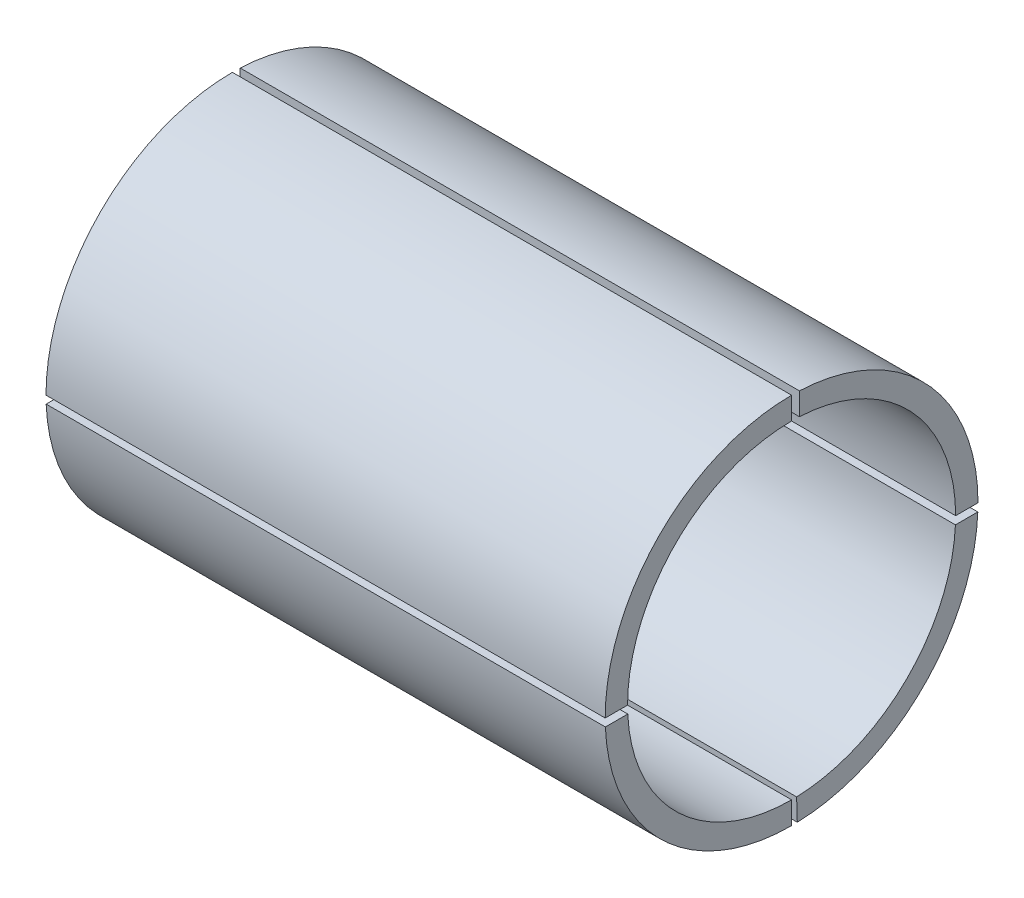
ISO-10303-21;
HEADER;
FILE_DESCRIPTION(('STEP AP214'),'2;1');
FILE_NAME('part.step','',(''),(''),'','','');
FILE_SCHEMA(('AUTOMOTIVE_DESIGN { 1 0 10303 214 1 1 1 1 }'));
ENDSEC;
DATA;
#1=APPLICATION_CONTEXT('core data for automotive mechanical design processes');
#2=APPLICATION_PROTOCOL_DEFINITION('international standard','automotive_design',2000,#1);
#3=PRODUCT_CONTEXT('',#1,'mechanical');
#4=PRODUCT('Part','Part','',(#3));
#5=PRODUCT_RELATED_PRODUCT_CATEGORY('part','',(#4));
#6=PRODUCT_DEFINITION_FORMATION('','',#4);
#7=PRODUCT_DEFINITION_CONTEXT('part definition',#1,'design');
#8=PRODUCT_DEFINITION('design','',#6,#7);
#9=PRODUCT_DEFINITION_SHAPE('','',#8);
#10=(LENGTH_UNIT() NAMED_UNIT(*) SI_UNIT(.MILLI.,.METRE.));
#11=(NAMED_UNIT(*) PLANE_ANGLE_UNIT() SI_UNIT($,.RADIAN.));
#12=(NAMED_UNIT(*) SI_UNIT($,.STERADIAN.) SOLID_ANGLE_UNIT());
#13=UNCERTAINTY_MEASURE_WITH_UNIT(LENGTH_MEASURE(1.E-05),#10,'distance_accuracy_value','');
#14=(GEOMETRIC_REPRESENTATION_CONTEXT(3) GLOBAL_UNCERTAINTY_ASSIGNED_CONTEXT((#13)) GLOBAL_UNIT_ASSIGNED_CONTEXT((#10,
#11,#12)) REPRESENTATION_CONTEXT('',''));
#15=CARTESIAN_POINT('',(0.,0.,0.));
#16=DIRECTION('',(0.,0.,1.));
#17=DIRECTION('',(1.,0.,0.));
#18=AXIS2_PLACEMENT_3D('',#15,#16,#17);
#19=CARTESIAN_POINT('',(15.,0.,0.));
#20=DIRECTION('',(-1.,0.,0.));
#21=DIRECTION('',(0.,0.,1.));
#22=AXIS2_PLACEMENT_3D('',#19,#20,#21);
#23=CYLINDRICAL_SURFACE('',#22,4.4);
#24=CARTESIAN_POINT('',(0.,0.,0.));
#25=DIRECTION('',(-1.,0.,0.));
#26=DIRECTION('',(0.,0.,-1.));
#27=AXIS2_PLACEMENT_3D('',#24,#25,#26);
#28=CIRCLE('',#27,4.4);
#29=CARTESIAN_POINT('',(0.,-0.209377525980943,-4.39501547797207));
#30=VERTEX_POINT('',#29);
#31=CARTESIAN_POINT('',(0.,-4.39794629655566,-0.134418646817995));
#32=VERTEX_POINT('',#31);
#33=EDGE_CURVE('E107',#30,#32,#28,.T.);
#34=ORIENTED_EDGE('',*,*,#33,.T.);
#35=DIRECTION('',(-1.,0.,0.));
#36=VECTOR('',#35,1.);
#37=CARTESIAN_POINT('',(15.,-4.39794629655566,-0.134418646817995));
#38=LINE('',#37,#36);
#39=CARTESIAN_POINT('',(15.,-4.39794629655566,-0.134418646817995));
#40=VERTEX_POINT('',#39);
#41=EDGE_CURVE('E12',#40,#32,#38,.T.);
#42=ORIENTED_EDGE('',*,*,#41,.F.);
#43=CARTESIAN_POINT('',(15.,0.,0.));
#44=DIRECTION('',(-1.,0.,0.));
#45=DIRECTION('',(0.,0.,-1.));
#46=AXIS2_PLACEMENT_3D('',#43,#44,#45);
#47=CIRCLE('',#46,4.4);
#48=CARTESIAN_POINT('',(15.,-0.209377525980943,-4.39501547797207));
#49=VERTEX_POINT('',#48);
#50=EDGE_CURVE('E95',#49,#40,#47,.T.);
#51=ORIENTED_EDGE('',*,*,#50,.F.);
#52=DIRECTION('',(-1.,0.,0.));
#53=VECTOR('',#52,1.);
#54=CARTESIAN_POINT('',(15.,-0.209377525980943,-4.39501547797207));
#55=LINE('',#54,#53);
#56=EDGE_CURVE('E103',#49,#30,#55,.T.);
#57=ORIENTED_EDGE('',*,*,#56,.T.);
#58=EDGE_LOOP('',(#34,#42,#51,#57));
#59=FACE_BOUND('',#58,.T.);
#60=ADVANCED_FACE('F44',(#59),#23,.F.);
#61=CARTESIAN_POINT('',(15.,-4.39794629655566,-0.134418646817995));
#62=DIRECTION('',(0.,0.0305496924586351,-0.999533249217195));
#63=DIRECTION('',(0.,0.999533249217195,0.0305496924586351));
#64=AXIS2_PLACEMENT_3D('',#61,#62,#63);
#65=PLANE('',#64);
#66=DIRECTION('',(0.,-0.999533249217195,-0.0305496924586351));
#67=VECTOR('',#66,1.);
#68=CARTESIAN_POINT('',(0.,-4.39794629655566,-0.134418646817995));
#69=LINE('',#68,#67);
#70=CARTESIAN_POINT('',(0.,-4.99766624608598,-0.152748462293174));
#71=VERTEX_POINT('',#70);
#72=EDGE_CURVE('E99',#32,#71,#69,.T.);
#73=ORIENTED_EDGE('',*,*,#72,.T.);
#74=DIRECTION('',(-1.,0.,0.));
#75=VECTOR('',#74,1.);
#76=CARTESIAN_POINT('',(15.,-4.99766624608598,-0.152748462293174));
#77=LINE('',#76,#75);
#78=CARTESIAN_POINT('',(15.,-4.99766624608598,-0.152748462293174));
#79=VERTEX_POINT('',#78);
#80=EDGE_CURVE('E52',#79,#71,#77,.T.);
#81=ORIENTED_EDGE('',*,*,#80,.F.);
#82=DIRECTION('',(0.,-0.999533249217195,-0.0305496924586351));
#83=VECTOR('',#82,1.);
#84=CARTESIAN_POINT('',(15.,-4.39794629655566,-0.134418646817995));
#85=LINE('',#84,#83);
#86=EDGE_CURVE('E90',#40,#79,#85,.T.);
#87=ORIENTED_EDGE('',*,*,#86,.F.);
#88=ORIENTED_EDGE('',*,*,#41,.T.);
#89=EDGE_LOOP('',(#73,#81,#87,#88));
#90=FACE_BOUND('',#89,.T.);
#91=ADVANCED_FACE('F98',(#90),#65,.F.);
#92=CARTESIAN_POINT('',(15.,0.,0.));
#93=DIRECTION('',(-1.,0.,0.));
#94=DIRECTION('',(0.,0.,1.));
#95=AXIS2_PLACEMENT_3D('',#92,#93,#94);
#96=CYLINDRICAL_SURFACE('',#95,5.);
#97=CARTESIAN_POINT('',(0.,0.,0.));
#98=DIRECTION('',(1.,0.,0.));
#99=DIRECTION('',(0.,0.,-1.));
#100=AXIS2_PLACEMENT_3D('',#97,#98,#99);
#101=CIRCLE('',#100,5.);
#102=CARTESIAN_POINT('',(0.,-0.209377525980943,-4.99561418162113));
#103=VERTEX_POINT('',#102);
#104=EDGE_CURVE('E77',#71,#103,#101,.T.);
#105=ORIENTED_EDGE('',*,*,#104,.T.);
#106=DIRECTION('',(-1.,0.,0.));
#107=VECTOR('',#106,1.);
#108=CARTESIAN_POINT('',(15.,-0.209377525980943,-4.99561418162113));
#109=LINE('',#108,#107);
#110=CARTESIAN_POINT('',(15.,-0.209377525980943,-4.99561418162113));
#111=VERTEX_POINT('',#110);
#112=EDGE_CURVE('E100',#111,#103,#109,.T.);
#113=ORIENTED_EDGE('',*,*,#112,.F.);
#114=CARTESIAN_POINT('',(15.,0.,0.));
#115=DIRECTION('',(1.,0.,0.));
#116=DIRECTION('',(0.,0.,-1.));
#117=AXIS2_PLACEMENT_3D('',#114,#115,#116);
#118=CIRCLE('',#117,5.);
#119=EDGE_CURVE('E93',#79,#111,#118,.T.);
#120=ORIENTED_EDGE('',*,*,#119,.F.);
#121=ORIENTED_EDGE('',*,*,#80,.T.);
#122=EDGE_LOOP('',(#105,#113,#120,#121));
#123=FACE_BOUND('',#122,.T.);
#124=ADVANCED_FACE('F101',(#123),#96,.T.);
#125=CARTESIAN_POINT('',(15.,-0.209377525980943,-4.39501547797207));
#126=DIRECTION('',(0.,-1.,0.));
#127=DIRECTION('',(0.,0.,-1.));
#128=AXIS2_PLACEMENT_3D('',#125,#126,#127);
#129=PLANE('',#128);
#130=DIRECTION('',(0.,0.,1.));
#131=VECTOR('',#130,1.);
#132=CARTESIAN_POINT('',(0.,-0.209377525980943,-4.39501547797207));
#133=LINE('',#132,#131);
#134=EDGE_CURVE('E83',#103,#30,#133,.T.);
#135=ORIENTED_EDGE('',*,*,#134,.T.);
#136=ORIENTED_EDGE('',*,*,#56,.F.);
#137=DIRECTION('',(0.,0.,1.));
#138=VECTOR('',#137,1.);
#139=CARTESIAN_POINT('',(15.,-0.209377525980943,-4.39501547797207));
#140=LINE('',#139,#138);
#141=EDGE_CURVE('E60',#111,#49,#140,.T.);
#142=ORIENTED_EDGE('',*,*,#141,.F.);
#143=ORIENTED_EDGE('',*,*,#112,.T.);
#144=EDGE_LOOP('',(#135,#136,#142,#143));
#145=FACE_BOUND('',#144,.T.);
#146=ADVANCED_FACE('F114',(#145),#129,.F.);
#147=CARTESIAN_POINT('',(15.,0.,0.));
#148=DIRECTION('',(1.,0.,0.));
#149=DIRECTION('',(0.,0.,-1.));
#150=AXIS2_PLACEMENT_3D('',#147,#148,#149);
#151=PLANE('',#150);
#152=ORIENTED_EDGE('',*,*,#50,.T.);
#153=ORIENTED_EDGE('',*,*,#86,.T.);
#154=ORIENTED_EDGE('',*,*,#119,.T.);
#155=ORIENTED_EDGE('',*,*,#141,.T.);
#156=EDGE_LOOP('',(#152,#153,#154,#155));
#157=FACE_BOUND('',#156,.T.);
#158=ADVANCED_FACE('F91',(#157),#151,.T.);
#159=CARTESIAN_POINT('',(0.,0.,0.));
#160=DIRECTION('',(1.,0.,0.));
#161=DIRECTION('',(0.,0.,-1.));
#162=AXIS2_PLACEMENT_3D('',#159,#160,#161);
#163=PLANE('',#162);
#164=ORIENTED_EDGE('',*,*,#33,.F.);
#165=ORIENTED_EDGE('',*,*,#134,.F.);
#166=ORIENTED_EDGE('',*,*,#104,.F.);
#167=ORIENTED_EDGE('',*,*,#72,.F.);
#168=EDGE_LOOP('',(#164,#165,#166,#167));
#169=FACE_BOUND('',#168,.T.);
#170=ADVANCED_FACE('F117',(#169),#163,.F.);
#171=CLOSED_SHELL('',(#60,#91,#124,#146,#158,#170));
#172=MANIFOLD_SOLID_BREP('B2',#171);
#173=CARTESIAN_POINT('',(15.,0.,0.));
#174=DIRECTION('',(-1.,0.,0.));
#175=DIRECTION('',(0.,0.,1.));
#176=AXIS2_PLACEMENT_3D('',#173,#174,#175);
#177=CYLINDRICAL_SURFACE('',#176,5.);
#178=CARTESIAN_POINT('',(0.,0.,0.));
#179=DIRECTION('',(1.,0.,0.));
#180=DIRECTION('',(0.,0.,-1.));
#181=AXIS2_PLACEMENT_3D('',#178,#179,#180);
#182=CIRCLE('',#181,5.);
#183=CARTESIAN_POINT('',(0.,-0.209377525980943,4.99561418162113));
#184=VERTEX_POINT('',#183);
#185=CARTESIAN_POINT('',(0.,-5.,0.));
#186=VERTEX_POINT('',#185);
#187=EDGE_CURVE('E241',#184,#186,#182,.T.);
#188=ORIENTED_EDGE('',*,*,#187,.T.);
#189=DIRECTION('',(-1.,0.,0.));
#190=VECTOR('',#189,1.);
#191=CARTESIAN_POINT('',(15.,-5.,0.));
#192=LINE('',#191,#190);
#193=CARTESIAN_POINT('',(15.,-5.,0.));
#194=VERTEX_POINT('',#193);
#195=EDGE_CURVE('E42',#194,#186,#192,.T.);
#196=ORIENTED_EDGE('',*,*,#195,.F.);
#197=CARTESIAN_POINT('',(15.,0.,0.));
#198=DIRECTION('',(1.,0.,0.));
#199=DIRECTION('',(0.,0.,-1.));
#200=AXIS2_PLACEMENT_3D('',#197,#198,#199);
#201=CIRCLE('',#200,5.);
#202=CARTESIAN_POINT('',(15.,-0.209377525980943,4.99561418162113));
#203=VERTEX_POINT('',#202);
#204=EDGE_CURVE('E229',#203,#194,#201,.T.);
#205=ORIENTED_EDGE('',*,*,#204,.F.);
#206=DIRECTION('',(-1.,0.,0.));
#207=VECTOR('',#206,1.);
#208=CARTESIAN_POINT('',(15.,-0.209377525980943,4.99561418162113));
#209=LINE('',#208,#207);
#210=EDGE_CURVE('E237',#203,#184,#209,.T.);
#211=ORIENTED_EDGE('',*,*,#210,.T.);
#212=EDGE_LOOP('',(#188,#196,#205,#211));
#213=FACE_BOUND('',#212,.T.);
#214=ADVANCED_FACE('F178',(#213),#177,.T.);
#215=CARTESIAN_POINT('',(15.,-4.4,0.));
#216=DIRECTION('',(0.,0.,1.));
#217=DIRECTION('',(0.,-1.,0.));
#218=AXIS2_PLACEMENT_3D('',#215,#216,#217);
#219=PLANE('',#218);
#220=DIRECTION('',(0.,1.,0.));
#221=VECTOR('',#220,1.);
#222=CARTESIAN_POINT('',(0.,-4.4,0.));
#223=LINE('',#222,#221);
#224=CARTESIAN_POINT('',(0.,-4.4,0.));
#225=VERTEX_POINT('',#224);
#226=EDGE_CURVE('E233',#186,#225,#223,.T.);
#227=ORIENTED_EDGE('',*,*,#226,.T.);
#228=DIRECTION('',(-1.,0.,0.));
#229=VECTOR('',#228,1.);
#230=CARTESIAN_POINT('',(15.,-4.4,0.));
#231=LINE('',#230,#229);
#232=CARTESIAN_POINT('',(15.,-4.4,0.));
#233=VERTEX_POINT('',#232);
#234=EDGE_CURVE('E186',#233,#225,#231,.T.);
#235=ORIENTED_EDGE('',*,*,#234,.F.);
#236=DIRECTION('',(0.,1.,0.));
#237=VECTOR('',#236,1.);
#238=CARTESIAN_POINT('',(15.,-4.4,0.));
#239=LINE('',#238,#237);
#240=EDGE_CURVE('E224',#194,#233,#239,.T.);
#241=ORIENTED_EDGE('',*,*,#240,.F.);
#242=ORIENTED_EDGE('',*,*,#195,.T.);
#243=EDGE_LOOP('',(#227,#235,#241,#242));
#244=FACE_BOUND('',#243,.T.);
#245=ADVANCED_FACE('F232',(#244),#219,.F.);
#246=CARTESIAN_POINT('',(15.,0.,0.));
#247=DIRECTION('',(-1.,0.,0.));
#248=DIRECTION('',(0.,0.,1.));
#249=AXIS2_PLACEMENT_3D('',#246,#247,#248);
#250=CYLINDRICAL_SURFACE('',#249,4.4);
#251=CARTESIAN_POINT('',(0.,0.,0.));
#252=DIRECTION('',(-1.,0.,0.));
#253=DIRECTION('',(0.,0.,-1.));
#254=AXIS2_PLACEMENT_3D('',#251,#252,#253);
#255=CIRCLE('',#254,4.4);
#256=CARTESIAN_POINT('',(0.,-0.209377525980942,4.39501547797207));
#257=VERTEX_POINT('',#256);
#258=EDGE_CURVE('E211',#225,#257,#255,.T.);
#259=ORIENTED_EDGE('',*,*,#258,.T.);
#260=DIRECTION('',(-1.,0.,0.));
#261=VECTOR('',#260,1.);
#262=CARTESIAN_POINT('',(15.,-0.209377525980942,4.39501547797207));
#263=LINE('',#262,#261);
#264=CARTESIAN_POINT('',(15.,-0.209377525980942,4.39501547797207));
#265=VERTEX_POINT('',#264);
#266=EDGE_CURVE('E234',#265,#257,#263,.T.);
#267=ORIENTED_EDGE('',*,*,#266,.F.);
#268=CARTESIAN_POINT('',(15.,0.,0.));
#269=DIRECTION('',(-1.,0.,0.));
#270=DIRECTION('',(0.,0.,-1.));
#271=AXIS2_PLACEMENT_3D('',#268,#269,#270);
#272=CIRCLE('',#271,4.4);
#273=EDGE_CURVE('E227',#233,#265,#272,.T.);
#274=ORIENTED_EDGE('',*,*,#273,.F.);
#275=ORIENTED_EDGE('',*,*,#234,.T.);
#276=EDGE_LOOP('',(#259,#267,#274,#275));
#277=FACE_BOUND('',#276,.T.);
#278=ADVANCED_FACE('F235',(#277),#250,.F.);
#279=CARTESIAN_POINT('',(15.,-0.209377525980943,4.39501547797207));
#280=DIRECTION('',(0.,-1.,0.));
#281=DIRECTION('',(0.,0.,-1.));
#282=AXIS2_PLACEMENT_3D('',#279,#280,#281);
#283=PLANE('',#282);
#284=DIRECTION('',(0.,0.,1.));
#285=VECTOR('',#284,1.);
#286=CARTESIAN_POINT('',(0.,-0.209377525980943,4.39501547797207));
#287=LINE('',#286,#285);
#288=EDGE_CURVE('E217',#257,#184,#287,.T.);
#289=ORIENTED_EDGE('',*,*,#288,.T.);
#290=ORIENTED_EDGE('',*,*,#210,.F.);
#291=DIRECTION('',(0.,0.,1.));
#292=VECTOR('',#291,1.);
#293=CARTESIAN_POINT('',(15.,-0.209377525980943,4.39501547797207));
#294=LINE('',#293,#292);
#295=EDGE_CURVE('E194',#265,#203,#294,.T.);
#296=ORIENTED_EDGE('',*,*,#295,.F.);
#297=ORIENTED_EDGE('',*,*,#266,.T.);
#298=EDGE_LOOP('',(#289,#290,#296,#297));
#299=FACE_BOUND('',#298,.T.);
#300=ADVANCED_FACE('F248',(#299),#283,.F.);
#301=CARTESIAN_POINT('',(15.,0.,0.));
#302=DIRECTION('',(1.,0.,0.));
#303=DIRECTION('',(0.,0.,-1.));
#304=AXIS2_PLACEMENT_3D('',#301,#302,#303);
#305=PLANE('',#304);
#306=ORIENTED_EDGE('',*,*,#204,.T.);
#307=ORIENTED_EDGE('',*,*,#240,.T.);
#308=ORIENTED_EDGE('',*,*,#273,.T.);
#309=ORIENTED_EDGE('',*,*,#295,.T.);
#310=EDGE_LOOP('',(#306,#307,#308,#309));
#311=FACE_BOUND('',#310,.T.);
#312=ADVANCED_FACE('F225',(#311),#305,.T.);
#313=CARTESIAN_POINT('',(0.,0.,0.));
#314=DIRECTION('',(1.,0.,0.));
#315=DIRECTION('',(0.,0.,-1.));
#316=AXIS2_PLACEMENT_3D('',#313,#314,#315);
#317=PLANE('',#316);
#318=ORIENTED_EDGE('',*,*,#187,.F.);
#319=ORIENTED_EDGE('',*,*,#288,.F.);
#320=ORIENTED_EDGE('',*,*,#258,.F.);
#321=ORIENTED_EDGE('',*,*,#226,.F.);
#322=EDGE_LOOP('',(#318,#319,#320,#321));
#323=FACE_BOUND('',#322,.T.);
#324=ADVANCED_FACE('F251',(#323),#317,.F.);
#325=CLOSED_SHELL('',(#214,#245,#278,#300,#312,#324));
#326=MANIFOLD_SOLID_BREP('B6',#325);
#327=CARTESIAN_POINT('',(15.,0.,0.));
#328=DIRECTION('',(-1.,0.,0.));
#329=DIRECTION('',(0.,0.,1.));
#330=AXIS2_PLACEMENT_3D('',#327,#328,#329);
#331=CYLINDRICAL_SURFACE('',#330,4.4);
#332=CARTESIAN_POINT('',(0.,0.,0.));
#333=DIRECTION('',(-1.,0.,0.));
#334=DIRECTION('',(0.,0.,-1.));
#335=AXIS2_PLACEMENT_3D('',#332,#333,#334);
#336=CIRCLE('',#335,4.4);
#337=CARTESIAN_POINT('',(0.,0.,4.4));
#338=VERTEX_POINT('',#337);
#339=CARTESIAN_POINT('',(0.,4.4,0.));
#340=VERTEX_POINT('',#339);
#341=EDGE_CURVE('E374',#338,#340,#336,.T.);
#342=ORIENTED_EDGE('',*,*,#341,.T.);
#343=DIRECTION('',(-1.,0.,0.));
#344=VECTOR('',#343,1.);
#345=CARTESIAN_POINT('',(15.,4.4,0.));
#346=LINE('',#345,#344);
#347=CARTESIAN_POINT('',(15.,4.4,0.));
#348=VERTEX_POINT('',#347);
#349=EDGE_CURVE('E176',#348,#340,#346,.T.);
#350=ORIENTED_EDGE('',*,*,#349,.F.);
#351=CARTESIAN_POINT('',(15.,0.,0.));
#352=DIRECTION('',(-1.,0.,0.));
#353=DIRECTION('',(0.,0.,-1.));
#354=AXIS2_PLACEMENT_3D('',#351,#352,#353);
#355=CIRCLE('',#354,4.4);
#356=CARTESIAN_POINT('',(15.,0.,4.4));
#357=VERTEX_POINT('',#356);
#358=EDGE_CURVE('E362',#357,#348,#355,.T.);
#359=ORIENTED_EDGE('',*,*,#358,.F.);
#360=DIRECTION('',(-1.,0.,0.));
#361=VECTOR('',#360,1.);
#362=CARTESIAN_POINT('',(15.,0.,4.4));
#363=LINE('',#362,#361);
#364=EDGE_CURVE('E370',#357,#338,#363,.T.);
#365=ORIENTED_EDGE('',*,*,#364,.T.);
#366=EDGE_LOOP('',(#342,#350,#359,#365));
#367=FACE_BOUND('',#366,.T.);
#368=ADVANCED_FACE('F311',(#367),#331,.F.);
#369=CARTESIAN_POINT('',(15.,5.,0.));
#370=DIRECTION('',(0.,0.,1.));
#371=DIRECTION('',(0.,-1.,0.));
#372=AXIS2_PLACEMENT_3D('',#369,#370,#371);
#373=PLANE('',#372);
#374=DIRECTION('',(0.,1.,0.));
#375=VECTOR('',#374,1.);
#376=CARTESIAN_POINT('',(0.,5.,0.));
#377=LINE('',#376,#375);
#378=CARTESIAN_POINT('',(0.,5.,0.));
#379=VERTEX_POINT('',#378);
#380=EDGE_CURVE('E366',#340,#379,#377,.T.);
#381=ORIENTED_EDGE('',*,*,#380,.T.);
#382=DIRECTION('',(-1.,0.,0.));
#383=VECTOR('',#382,1.);
#384=CARTESIAN_POINT('',(15.,5.,0.));
#385=LINE('',#384,#383);
#386=CARTESIAN_POINT('',(15.,5.,0.));
#387=VERTEX_POINT('',#386);
#388=EDGE_CURVE('E319',#387,#379,#385,.T.);
#389=ORIENTED_EDGE('',*,*,#388,.F.);
#390=DIRECTION('',(0.,1.,0.));
#391=VECTOR('',#390,1.);
#392=CARTESIAN_POINT('',(15.,5.,0.));
#393=LINE('',#392,#391);
#394=EDGE_CURVE('E357',#348,#387,#393,.T.);
#395=ORIENTED_EDGE('',*,*,#394,.F.);
#396=ORIENTED_EDGE('',*,*,#349,.T.);
#397=EDGE_LOOP('',(#381,#389,#395,#396));
#398=FACE_BOUND('',#397,.T.);
#399=ADVANCED_FACE('F365',(#398),#373,.F.);
#400=CARTESIAN_POINT('',(15.,0.,0.));
#401=DIRECTION('',(-1.,0.,0.));
#402=DIRECTION('',(0.,0.,1.));
#403=AXIS2_PLACEMENT_3D('',#400,#401,#402);
#404=CYLINDRICAL_SURFACE('',#403,5.);
#405=CARTESIAN_POINT('',(0.,0.,0.));
#406=DIRECTION('',(1.,0.,0.));
#407=DIRECTION('',(0.,0.,-1.));
#408=AXIS2_PLACEMENT_3D('',#405,#406,#407);
#409=CIRCLE('',#408,5.);
#410=CARTESIAN_POINT('',(0.,0.,5.));
#411=VERTEX_POINT('',#410);
#412=EDGE_CURVE('E344',#379,#411,#409,.T.);
#413=ORIENTED_EDGE('',*,*,#412,.T.);
#414=DIRECTION('',(-1.,0.,0.));
#415=VECTOR('',#414,1.);
#416=CARTESIAN_POINT('',(15.,0.,5.));
#417=LINE('',#416,#415);
#418=CARTESIAN_POINT('',(15.,0.,5.));
#419=VERTEX_POINT('',#418);
#420=EDGE_CURVE('E367',#419,#411,#417,.T.);
#421=ORIENTED_EDGE('',*,*,#420,.F.);
#422=CARTESIAN_POINT('',(15.,0.,0.));
#423=DIRECTION('',(1.,0.,0.));
#424=DIRECTION('',(0.,0.,-1.));
#425=AXIS2_PLACEMENT_3D('',#422,#423,#424);
#426=CIRCLE('',#425,5.);
#427=EDGE_CURVE('E360',#387,#419,#426,.T.);
#428=ORIENTED_EDGE('',*,*,#427,.F.);
#429=ORIENTED_EDGE('',*,*,#388,.T.);
#430=EDGE_LOOP('',(#413,#421,#428,#429));
#431=FACE_BOUND('',#430,.T.);
#432=ADVANCED_FACE('F368',(#431),#404,.T.);
#433=CARTESIAN_POINT('',(15.,0.,4.4));
#434=DIRECTION('',(0.,1.,0.));
#435=DIRECTION('',(0.,0.,1.));
#436=AXIS2_PLACEMENT_3D('',#433,#434,#435);
#437=PLANE('',#436);
#438=DIRECTION('',(0.,0.,-1.));
#439=VECTOR('',#438,1.);
#440=CARTESIAN_POINT('',(0.,0.,4.4));
#441=LINE('',#440,#439);
#442=EDGE_CURVE('E350',#411,#338,#441,.T.);
#443=ORIENTED_EDGE('',*,*,#442,.T.);
#444=ORIENTED_EDGE('',*,*,#364,.F.);
#445=DIRECTION('',(0.,0.,-1.));
#446=VECTOR('',#445,1.);
#447=CARTESIAN_POINT('',(15.,0.,4.4));
#448=LINE('',#447,#446);
#449=EDGE_CURVE('E327',#419,#357,#448,.T.);
#450=ORIENTED_EDGE('',*,*,#449,.F.);
#451=ORIENTED_EDGE('',*,*,#420,.T.);
#452=EDGE_LOOP('',(#443,#444,#450,#451));
#453=FACE_BOUND('',#452,.T.);
#454=ADVANCED_FACE('F381',(#453),#437,.F.);
#455=CARTESIAN_POINT('',(15.,0.,0.));
#456=DIRECTION('',(1.,0.,0.));
#457=DIRECTION('',(0.,0.,-1.));
#458=AXIS2_PLACEMENT_3D('',#455,#456,#457);
#459=PLANE('',#458);
#460=ORIENTED_EDGE('',*,*,#358,.T.);
#461=ORIENTED_EDGE('',*,*,#394,.T.);
#462=ORIENTED_EDGE('',*,*,#427,.T.);
#463=ORIENTED_EDGE('',*,*,#449,.T.);
#464=EDGE_LOOP('',(#460,#461,#462,#463));
#465=FACE_BOUND('',#464,.T.);
#466=ADVANCED_FACE('F358',(#465),#459,.T.);
#467=CARTESIAN_POINT('',(0.,0.,0.));
#468=DIRECTION('',(1.,0.,0.));
#469=DIRECTION('',(0.,0.,-1.));
#470=AXIS2_PLACEMENT_3D('',#467,#468,#469);
#471=PLANE('',#470);
#472=ORIENTED_EDGE('',*,*,#341,.F.);
#473=ORIENTED_EDGE('',*,*,#442,.F.);
#474=ORIENTED_EDGE('',*,*,#412,.F.);
#475=ORIENTED_EDGE('',*,*,#380,.F.);
#476=EDGE_LOOP('',(#472,#473,#474,#475));
#477=FACE_BOUND('',#476,.T.);
#478=ADVANCED_FACE('F384',(#477),#471,.F.);
#479=CLOSED_SHELL('',(#368,#399,#432,#454,#466,#478));
#480=MANIFOLD_SOLID_BREP('B36',#479);
#481=CARTESIAN_POINT('',(15.,0.,0.));
#482=DIRECTION('',(-1.,0.,0.));
#483=DIRECTION('',(0.,0.,1.));
#484=AXIS2_PLACEMENT_3D('',#481,#482,#483);
#485=CYLINDRICAL_SURFACE('',#484,4.4);
#486=CARTESIAN_POINT('',(0.,0.,0.));
#487=DIRECTION('',(-1.,0.,0.));
#488=DIRECTION('',(0.,0.,-1.));
#489=AXIS2_PLACEMENT_3D('',#486,#487,#488);
#490=CIRCLE('',#489,4.4);
#491=CARTESIAN_POINT('',(0.,4.39500027849258,-0.209696332943927));
#492=VERTEX_POINT('',#491);
#493=CARTESIAN_POINT('',(0.,0.,-4.4));
#494=VERTEX_POINT('',#493);
#495=EDGE_CURVE('E498',#492,#494,#490,.T.);
#496=ORIENTED_EDGE('',*,*,#495,.T.);
#497=DIRECTION('',(-1.,0.,0.));
#498=VECTOR('',#497,1.);
#499=CARTESIAN_POINT('',(15.,0.,-4.4));
#500=LINE('',#499,#498);
#501=CARTESIAN_POINT('',(15.,0.,-4.4));
#502=VERTEX_POINT('',#501);
#503=EDGE_CURVE('E309',#502,#494,#500,.T.);
#504=ORIENTED_EDGE('',*,*,#503,.F.);
#505=CARTESIAN_POINT('',(15.,0.,0.));
#506=DIRECTION('',(-1.,0.,0.));
#507=DIRECTION('',(0.,0.,-1.));
#508=AXIS2_PLACEMENT_3D('',#505,#506,#507);
#509=CIRCLE('',#508,4.4);
#510=CARTESIAN_POINT('',(15.,4.39500027849258,-0.209696332943927));
#511=VERTEX_POINT('',#510);
#512=EDGE_CURVE('E486',#511,#502,#509,.T.);
#513=ORIENTED_EDGE('',*,*,#512,.F.);
#514=DIRECTION('',(-1.,0.,0.));
#515=VECTOR('',#514,1.);
#516=CARTESIAN_POINT('',(15.,4.39500027849258,-0.209696332943927));
#517=LINE('',#516,#515);
#518=EDGE_CURVE('E494',#511,#492,#517,.T.);
#519=ORIENTED_EDGE('',*,*,#518,.T.);
#520=EDGE_LOOP('',(#496,#504,#513,#519));
#521=FACE_BOUND('',#520,.T.);
#522=ADVANCED_FACE('F435',(#521),#485,.F.);
#523=CARTESIAN_POINT('',(15.,0.,-4.4));
#524=DIRECTION('',(0.,1.,0.));
#525=DIRECTION('',(0.,0.,1.));
#526=AXIS2_PLACEMENT_3D('',#523,#524,#525);
#527=PLANE('',#526);
#528=DIRECTION('',(0.,0.,-1.));
#529=VECTOR('',#528,1.);
#530=CARTESIAN_POINT('',(0.,0.,-4.4));
#531=LINE('',#530,#529);
#532=CARTESIAN_POINT('',(0.,0.,-5.));
#533=VERTEX_POINT('',#532);
#534=EDGE_CURVE('E490',#494,#533,#531,.T.);
#535=ORIENTED_EDGE('',*,*,#534,.T.);
#536=DIRECTION('',(-1.,0.,0.));
#537=VECTOR('',#536,1.);
#538=CARTESIAN_POINT('',(15.,0.,-5.));
#539=LINE('',#538,#537);
#540=CARTESIAN_POINT('',(15.,0.,-5.));
#541=VERTEX_POINT('',#540);
#542=EDGE_CURVE('E443',#541,#533,#539,.T.);
#543=ORIENTED_EDGE('',*,*,#542,.F.);
#544=DIRECTION('',(0.,0.,-1.));
#545=VECTOR('',#544,1.);
#546=CARTESIAN_POINT('',(15.,0.,-4.4));
#547=LINE('',#546,#545);
#548=EDGE_CURVE('E481',#502,#541,#547,.T.);
#549=ORIENTED_EDGE('',*,*,#548,.F.);
#550=ORIENTED_EDGE('',*,*,#503,.T.);
#551=EDGE_LOOP('',(#535,#543,#549,#550));
#552=FACE_BOUND('',#551,.T.);
#553=ADVANCED_FACE('F489',(#552),#527,.F.);
#554=CARTESIAN_POINT('',(15.,0.,0.));
#555=DIRECTION('',(-1.,0.,0.));
#556=DIRECTION('',(0.,0.,1.));
#557=AXIS2_PLACEMENT_3D('',#554,#555,#556);
#558=CYLINDRICAL_SURFACE('',#557,5.);
#559=CARTESIAN_POINT('',(0.,0.,0.));
#560=DIRECTION('',(1.,0.,0.));
#561=DIRECTION('',(0.,0.,-1.));
#562=AXIS2_PLACEMENT_3D('',#559,#560,#561);
#563=CIRCLE('',#562,5.);
#564=CARTESIAN_POINT('',(0.,4.99560080950729,-0.209696332943928));
#565=VERTEX_POINT('',#564);
#566=EDGE_CURVE('E468',#533,#565,#563,.T.);
#567=ORIENTED_EDGE('',*,*,#566,.T.);
#568=DIRECTION('',(-1.,0.,0.));
#569=VECTOR('',#568,1.);
#570=CARTESIAN_POINT('',(15.,4.99560080950729,-0.209696332943928));
#571=LINE('',#570,#569);
#572=CARTESIAN_POINT('',(15.,4.99560080950729,-0.209696332943928));
#573=VERTEX_POINT('',#572);
#574=EDGE_CURVE('E491',#573,#565,#571,.T.);
#575=ORIENTED_EDGE('',*,*,#574,.F.);
#576=CARTESIAN_POINT('',(15.,0.,0.));
#577=DIRECTION('',(1.,0.,0.));
#578=DIRECTION('',(0.,0.,-1.));
#579=AXIS2_PLACEMENT_3D('',#576,#577,#578);
#580=CIRCLE('',#579,5.);
#581=EDGE_CURVE('E484',#541,#573,#580,.T.);
#582=ORIENTED_EDGE('',*,*,#581,.F.);
#583=ORIENTED_EDGE('',*,*,#542,.T.);
#584=EDGE_LOOP('',(#567,#575,#582,#583));
#585=FACE_BOUND('',#584,.T.);
#586=ADVANCED_FACE('F492',(#585),#558,.T.);
#587=CARTESIAN_POINT('',(15.,4.99560080950729,-0.209696332943927));
#588=DIRECTION('',(0.,0.,-1.));
#589=DIRECTION('',(-1.,0.,0.));
#590=AXIS2_PLACEMENT_3D('',#587,#588,#589);
#591=PLANE('',#590);
#592=DIRECTION('',(0.,-1.,0.));
#593=VECTOR('',#592,1.);
#594=CARTESIAN_POINT('',(0.,4.99560080950729,-0.209696332943927));
#595=LINE('',#594,#593);
#596=EDGE_CURVE('E474',#565,#492,#595,.T.);
#597=ORIENTED_EDGE('',*,*,#596,.T.);
#598=ORIENTED_EDGE('',*,*,#518,.F.);
#599=DIRECTION('',(0.,-1.,0.));
#600=VECTOR('',#599,1.);
#601=CARTESIAN_POINT('',(15.,4.99560080950729,-0.209696332943927));
#602=LINE('',#601,#600);
#603=EDGE_CURVE('E451',#573,#511,#602,.T.);
#604=ORIENTED_EDGE('',*,*,#603,.F.);
#605=ORIENTED_EDGE('',*,*,#574,.T.);
#606=EDGE_LOOP('',(#597,#598,#604,#605));
#607=FACE_BOUND('',#606,.T.);
#608=ADVANCED_FACE('F505',(#607),#591,.F.);
#609=CARTESIAN_POINT('',(15.,0.,0.));
#610=DIRECTION('',(1.,0.,0.));
#611=DIRECTION('',(0.,0.,-1.));
#612=AXIS2_PLACEMENT_3D('',#609,#610,#611);
#613=PLANE('',#612);
#614=ORIENTED_EDGE('',*,*,#512,.T.);
#615=ORIENTED_EDGE('',*,*,#548,.T.);
#616=ORIENTED_EDGE('',*,*,#581,.T.);
#617=ORIENTED_EDGE('',*,*,#603,.T.);
#618=EDGE_LOOP('',(#614,#615,#616,#617));
#619=FACE_BOUND('',#618,.T.);
#620=ADVANCED_FACE('F482',(#619),#613,.T.);
#621=CARTESIAN_POINT('',(0.,0.,0.));
#622=DIRECTION('',(1.,0.,0.));
#623=DIRECTION('',(0.,0.,-1.));
#624=AXIS2_PLACEMENT_3D('',#621,#622,#623);
#625=PLANE('',#624);
#626=ORIENTED_EDGE('',*,*,#495,.F.);
#627=ORIENTED_EDGE('',*,*,#596,.F.);
#628=ORIENTED_EDGE('',*,*,#566,.F.);
#629=ORIENTED_EDGE('',*,*,#534,.F.);
#630=EDGE_LOOP('',(#626,#627,#628,#629));
#631=FACE_BOUND('',#630,.T.);
#632=ADVANCED_FACE('F508',(#631),#625,.F.);
#633=CLOSED_SHELL('',(#522,#553,#586,#608,#620,#632));
#634=MANIFOLD_SOLID_BREP('B170',#633);
#635=ADVANCED_BREP_SHAPE_REPRESENTATION('',(#18,#172,#326,#480,#634),#14);
#636=SHAPE_DEFINITION_REPRESENTATION(#9,#635);
ENDSEC;
END-ISO-10303-21;
